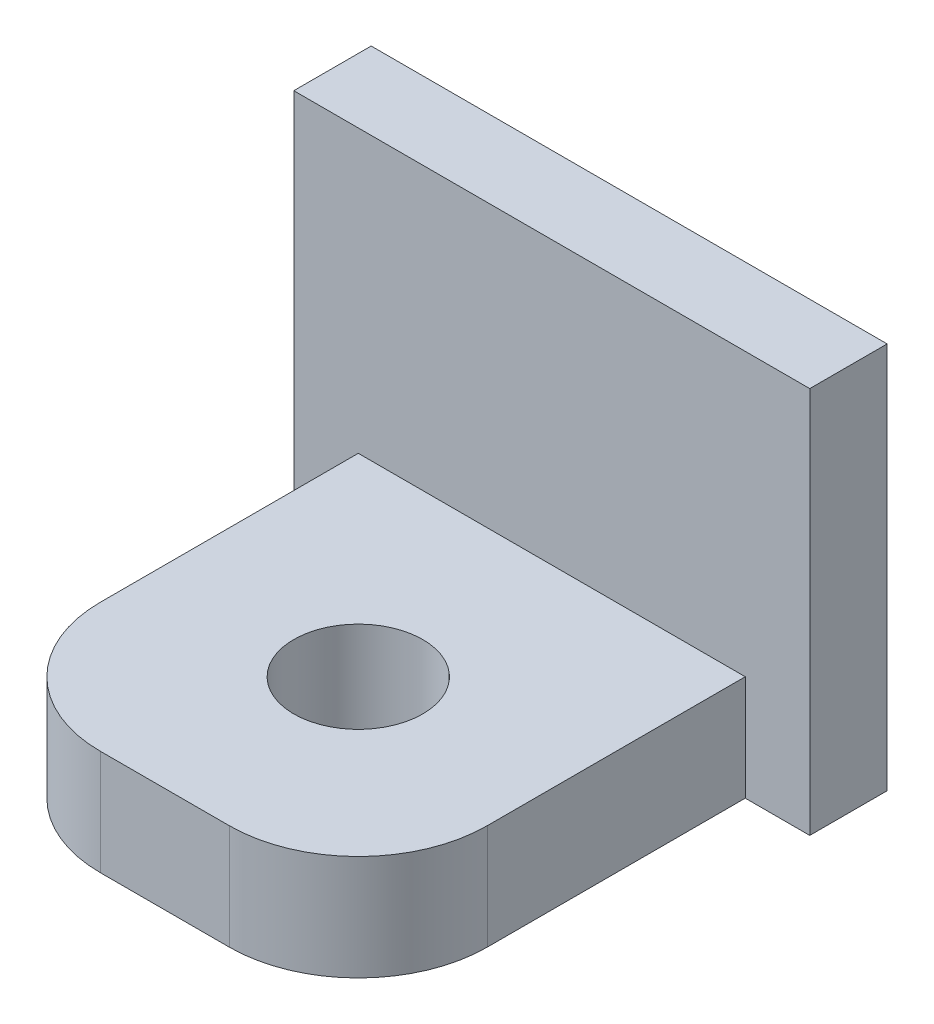
ISO-10303-21;
HEADER;
FILE_DESCRIPTION(('STEP AP214'),'2;1');
FILE_NAME('part.step','',(''),(''),'','','');
FILE_SCHEMA(('AUTOMOTIVE_DESIGN { 1 0 10303 214 1 1 1 1 }'));
ENDSEC;
DATA;
#1=APPLICATION_CONTEXT('core data for automotive mechanical design processes');
#2=APPLICATION_PROTOCOL_DEFINITION('international standard','automotive_design',2000,#1);
#3=PRODUCT_CONTEXT('',#1,'mechanical');
#4=PRODUCT('Part','Part','',(#3));
#5=PRODUCT_RELATED_PRODUCT_CATEGORY('part','',(#4));
#6=PRODUCT_DEFINITION_FORMATION('','',#4);
#7=PRODUCT_DEFINITION_CONTEXT('part definition',#1,'design');
#8=PRODUCT_DEFINITION('design','',#6,#7);
#9=PRODUCT_DEFINITION_SHAPE('','',#8);
#10=(LENGTH_UNIT() NAMED_UNIT(*) SI_UNIT(.MILLI.,.METRE.));
#11=(NAMED_UNIT(*) PLANE_ANGLE_UNIT() SI_UNIT($,.RADIAN.));
#12=(NAMED_UNIT(*) SI_UNIT($,.STERADIAN.) SOLID_ANGLE_UNIT());
#13=UNCERTAINTY_MEASURE_WITH_UNIT(LENGTH_MEASURE(1.E-05),#10,'distance_accuracy_value','');
#14=(GEOMETRIC_REPRESENTATION_CONTEXT(3) GLOBAL_UNCERTAINTY_ASSIGNED_CONTEXT((#13)) GLOBAL_UNIT_ASSIGNED_CONTEXT((#10,
#11,#12)) REPRESENTATION_CONTEXT('',''));
#15=CARTESIAN_POINT('',(0.,0.,0.));
#16=DIRECTION('',(0.,0.,1.));
#17=DIRECTION('',(1.,0.,0.));
#18=AXIS2_PLACEMENT_3D('',#15,#16,#17);
#19=CARTESIAN_POINT('',(5.,0.,26.));
#20=DIRECTION('',(0.,-1.,0.));
#21=DIRECTION('',(0.,0.,-1.));
#22=AXIS2_PLACEMENT_3D('',#19,#20,#21);
#23=CYLINDRICAL_SURFACE('',#22,10.);
#24=DIRECTION('',(0.,1.,0.));
#25=VECTOR('',#24,1.);
#26=CARTESIAN_POINT('',(5.,0.,36.));
#27=LINE('',#26,#25);
#28=CARTESIAN_POINT('',(4.99999999999999,-15.,36.));
#29=VERTEX_POINT('',#28);
#30=CARTESIAN_POINT('',(4.99999999999999,-6.84521,36.));
#31=VERTEX_POINT('',#30);
#32=EDGE_CURVE('E184',#29,#31,#27,.T.);
#33=ORIENTED_EDGE('',*,*,#32,.F.);
#34=CARTESIAN_POINT('',(5.,-15.,26.));
#35=DIRECTION('',(0.,-1.,0.));
#36=DIRECTION('',(1.,0.,0.));
#37=AXIS2_PLACEMENT_3D('',#34,#35,#36);
#38=CIRCLE('',#37,10.);
#39=CARTESIAN_POINT('',(15.,-15.,26.));
#40=VERTEX_POINT('',#39);
#41=EDGE_CURVE('E40',#40,#29,#38,.T.);
#42=ORIENTED_EDGE('',*,*,#41,.F.);
#43=DIRECTION('',(0.,1.,0.));
#44=VECTOR('',#43,1.);
#45=CARTESIAN_POINT('',(15.,0.,26.));
#46=LINE('',#45,#44);
#47=CARTESIAN_POINT('',(15.,-6.84521,26.));
#48=VERTEX_POINT('',#47);
#49=EDGE_CURVE('E187',#48,#40,#46,.F.);
#50=ORIENTED_EDGE('',*,*,#49,.F.);
#51=CARTESIAN_POINT('',(5.,-6.84521,26.));
#52=DIRECTION('',(0.,1.,0.));
#53=DIRECTION('',(0.,0.,1.));
#54=AXIS2_PLACEMENT_3D('',#51,#52,#53);
#55=CIRCLE('',#54,10.);
#56=EDGE_CURVE('E11',#31,#48,#55,.T.);
#57=ORIENTED_EDGE('',*,*,#56,.F.);
#58=EDGE_LOOP('',(#33,#42,#50,#57));
#59=FACE_BOUND('',#58,.T.);
#60=ADVANCED_FACE('F33',(#59),#23,.T.);
#61=CARTESIAN_POINT('',(-5.,-15.,26.));
#62=DIRECTION('',(0.,1.,0.));
#63=DIRECTION('',(0.,0.,1.));
#64=AXIS2_PLACEMENT_3D('',#61,#62,#63);
#65=CYLINDRICAL_SURFACE('',#64,10.);
#66=DIRECTION('',(0.,1.,0.));
#67=VECTOR('',#66,1.);
#68=CARTESIAN_POINT('',(-15.,-15.,26.));
#69=LINE('',#68,#67);
#70=CARTESIAN_POINT('',(-15.,-15.,26.));
#71=VERTEX_POINT('',#70);
#72=CARTESIAN_POINT('',(-15.,-6.84521,26.));
#73=VERTEX_POINT('',#72);
#74=EDGE_CURVE('E168',#71,#73,#69,.T.);
#75=ORIENTED_EDGE('',*,*,#74,.F.);
#76=CARTESIAN_POINT('',(-5.,-15.,26.));
#77=DIRECTION('',(0.,-1.,0.));
#78=DIRECTION('',(1.,0.,0.));
#79=AXIS2_PLACEMENT_3D('',#76,#77,#78);
#80=CIRCLE('',#79,10.);
#81=CARTESIAN_POINT('',(-5.,-15.,36.));
#82=VERTEX_POINT('',#81);
#83=EDGE_CURVE('E180',#82,#71,#80,.T.);
#84=ORIENTED_EDGE('',*,*,#83,.F.);
#85=DIRECTION('',(0.,1.,0.));
#86=VECTOR('',#85,1.);
#87=CARTESIAN_POINT('',(-5.,0.,36.));
#88=LINE('',#87,#86);
#89=CARTESIAN_POINT('',(-5.,-6.84521,36.));
#90=VERTEX_POINT('',#89);
#91=EDGE_CURVE('E177',#90,#82,#88,.F.);
#92=ORIENTED_EDGE('',*,*,#91,.F.);
#93=CARTESIAN_POINT('',(-5.,-6.84521,26.));
#94=DIRECTION('',(0.,1.,0.));
#95=DIRECTION('',(0.,0.,1.));
#96=AXIS2_PLACEMENT_3D('',#93,#94,#95);
#97=CIRCLE('',#96,10.);
#98=EDGE_CURVE('E182',#73,#90,#97,.T.);
#99=ORIENTED_EDGE('',*,*,#98,.F.);
#100=EDGE_LOOP('',(#75,#84,#92,#99));
#101=FACE_BOUND('',#100,.T.);
#102=ADVANCED_FACE('F216',(#101),#65,.T.);
#103=CARTESIAN_POINT('',(20.,15.,6.));
#104=DIRECTION('',(1.,0.,0.));
#105=DIRECTION('',(0.,1.,0.));
#106=AXIS2_PLACEMENT_3D('',#103,#104,#105);
#107=PLANE('',#106);
#108=DIRECTION('',(0.,-1.,0.));
#109=VECTOR('',#108,1.);
#110=CARTESIAN_POINT('',(20.,15.,0.));
#111=LINE('',#110,#109);
#112=CARTESIAN_POINT('',(20.,15.,0.));
#113=VERTEX_POINT('',#112);
#114=CARTESIAN_POINT('',(20.,-15.,0.));
#115=VERTEX_POINT('',#114);
#116=EDGE_CURVE('E143',#113,#115,#111,.T.);
#117=ORIENTED_EDGE('',*,*,#116,.F.);
#118=DIRECTION('',(0.,0.,-1.));
#119=VECTOR('',#118,1.);
#120=CARTESIAN_POINT('',(20.,15.,6.));
#121=LINE('',#120,#119);
#122=CARTESIAN_POINT('',(20.,15.,6.));
#123=VERTEX_POINT('',#122);
#124=EDGE_CURVE('E166',#123,#113,#121,.T.);
#125=ORIENTED_EDGE('',*,*,#124,.F.);
#126=DIRECTION('',(0.,-1.,0.));
#127=VECTOR('',#126,1.);
#128=CARTESIAN_POINT('',(20.,15.,6.));
#129=LINE('',#128,#127);
#130=CARTESIAN_POINT('',(20.,-15.,6.));
#131=VERTEX_POINT('',#130);
#132=EDGE_CURVE('E144',#123,#131,#129,.T.);
#133=ORIENTED_EDGE('',*,*,#132,.T.);
#134=DIRECTION('',(0.,0.,-1.));
#135=VECTOR('',#134,1.);
#136=CARTESIAN_POINT('',(20.,-15.,6.));
#137=LINE('',#136,#135);
#138=EDGE_CURVE('E156',#131,#115,#137,.T.);
#139=ORIENTED_EDGE('',*,*,#138,.T.);
#140=EDGE_LOOP('',(#117,#125,#133,#139));
#141=FACE_BOUND('',#140,.T.);
#142=ADVANCED_FACE('F220',(#141),#107,.T.);
#143=CARTESIAN_POINT('',(20.,15.,6.));
#144=DIRECTION('',(0.,-1.,0.));
#145=DIRECTION('',(1.,0.,0.));
#146=AXIS2_PLACEMENT_3D('',#143,#144,#145);
#147=PLANE('',#146);
#148=DIRECTION('',(-1.,0.,0.));
#149=VECTOR('',#148,1.);
#150=CARTESIAN_POINT('',(20.,15.,0.));
#151=LINE('',#150,#149);
#152=CARTESIAN_POINT('',(-20.,15.,0.));
#153=VERTEX_POINT('',#152);
#154=EDGE_CURVE('E148',#113,#153,#151,.T.);
#155=ORIENTED_EDGE('',*,*,#154,.T.);
#156=DIRECTION('',(0.,0.,-1.));
#157=VECTOR('',#156,1.);
#158=CARTESIAN_POINT('',(-20.,15.,6.));
#159=LINE('',#158,#157);
#160=CARTESIAN_POINT('',(-20.,15.,6.));
#161=VERTEX_POINT('',#160);
#162=EDGE_CURVE('E169',#161,#153,#159,.T.);
#163=ORIENTED_EDGE('',*,*,#162,.F.);
#164=DIRECTION('',(-1.,0.,0.));
#165=VECTOR('',#164,1.);
#166=CARTESIAN_POINT('',(20.,15.,6.));
#167=LINE('',#166,#165);
#168=EDGE_CURVE('E154',#123,#161,#167,.T.);
#169=ORIENTED_EDGE('',*,*,#168,.F.);
#170=ORIENTED_EDGE('',*,*,#124,.T.);
#171=EDGE_LOOP('',(#155,#163,#169,#170));
#172=FACE_BOUND('',#171,.T.);
#173=ADVANCED_FACE('F211',(#172),#147,.F.);
#174=CARTESIAN_POINT('',(-20.,15.,6.));
#175=DIRECTION('',(1.,0.,0.));
#176=DIRECTION('',(0.,1.,0.));
#177=AXIS2_PLACEMENT_3D('',#174,#175,#176);
#178=PLANE('',#177);
#179=DIRECTION('',(0.,-1.,0.));
#180=VECTOR('',#179,1.);
#181=CARTESIAN_POINT('',(-20.,15.,0.));
#182=LINE('',#181,#180);
#183=CARTESIAN_POINT('',(-20.,-15.,0.));
#184=VERTEX_POINT('',#183);
#185=EDGE_CURVE('E162',#153,#184,#182,.T.);
#186=ORIENTED_EDGE('',*,*,#185,.T.);
#187=DIRECTION('',(0.,0.,-1.));
#188=VECTOR('',#187,1.);
#189=CARTESIAN_POINT('',(-20.,-15.,6.));
#190=LINE('',#189,#188);
#191=CARTESIAN_POINT('',(-20.,-15.,6.));
#192=VERTEX_POINT('',#191);
#193=EDGE_CURVE('E172',#192,#184,#190,.T.);
#194=ORIENTED_EDGE('',*,*,#193,.F.);
#195=DIRECTION('',(0.,-1.,0.));
#196=VECTOR('',#195,1.);
#197=CARTESIAN_POINT('',(-20.,15.,6.));
#198=LINE('',#197,#196);
#199=EDGE_CURVE('E151',#161,#192,#198,.T.);
#200=ORIENTED_EDGE('',*,*,#199,.F.);
#201=ORIENTED_EDGE('',*,*,#162,.T.);
#202=EDGE_LOOP('',(#186,#194,#200,#201));
#203=FACE_BOUND('',#202,.T.);
#204=ADVANCED_FACE('F203',(#203),#178,.F.);
#205=CARTESIAN_POINT('',(20.,-15.,6.));
#206=DIRECTION('',(0.,-1.,0.));
#207=DIRECTION('',(1.,0.,0.));
#208=AXIS2_PLACEMENT_3D('',#205,#206,#207);
#209=PLANE('',#208);
#210=CARTESIAN_POINT('',(0.,-15.,21.));
#211=DIRECTION('',(0.,-1.,0.));
#212=DIRECTION('',(1.,0.,0.));
#213=AXIS2_PLACEMENT_3D('',#210,#211,#212);
#214=CIRCLE('',#213,5.);
#215=CARTESIAN_POINT('',(5.,-15.,21.));
#216=VERTEX_POINT('',#215);
#217=EDGE_CURVE('E131',#216,#216,#214,.T.);
#218=ORIENTED_EDGE('',*,*,#217,.F.);
#219=EDGE_LOOP('',(#218));
#220=FACE_BOUND('',#219,.T.);
#221=DIRECTION('',(0.,0.,-1.));
#222=VECTOR('',#221,1.);
#223=CARTESIAN_POINT('',(15.,-15.,36.));
#224=LINE('',#223,#222);
#225=CARTESIAN_POINT('',(15.,-15.,6.));
#226=VERTEX_POINT('',#225);
#227=EDGE_CURVE('E112',#40,#226,#224,.T.);
#228=ORIENTED_EDGE('',*,*,#227,.F.);
#229=ORIENTED_EDGE('',*,*,#41,.T.);
#230=DIRECTION('',(1.,0.,0.));
#231=VECTOR('',#230,1.);
#232=CARTESIAN_POINT('',(-15.,-15.,36.));
#233=LINE('',#232,#231);
#234=EDGE_CURVE('E138',#82,#29,#233,.T.);
#235=ORIENTED_EDGE('',*,*,#234,.F.);
#236=ORIENTED_EDGE('',*,*,#83,.T.);
#237=DIRECTION('',(0.,0.,-1.));
#238=VECTOR('',#237,1.);
#239=CARTESIAN_POINT('',(-15.,-15.,36.));
#240=LINE('',#239,#238);
#241=CARTESIAN_POINT('',(-15.,-15.,6.));
#242=VERTEX_POINT('',#241);
#243=EDGE_CURVE('E139',#71,#242,#240,.T.);
#244=ORIENTED_EDGE('',*,*,#243,.T.);
#245=DIRECTION('',(-1.,0.,0.));
#246=VECTOR('',#245,1.);
#247=CARTESIAN_POINT('',(20.,-15.,6.));
#248=LINE('',#247,#246);
#249=EDGE_CURVE('E147',#242,#192,#248,.T.);
#250=ORIENTED_EDGE('',*,*,#249,.T.);
#251=ORIENTED_EDGE('',*,*,#193,.T.);
#252=DIRECTION('',(-1.,0.,0.));
#253=VECTOR('',#252,1.);
#254=CARTESIAN_POINT('',(20.,-15.,0.));
#255=LINE('',#254,#253);
#256=EDGE_CURVE('E159',#115,#184,#255,.T.);
#257=ORIENTED_EDGE('',*,*,#256,.F.);
#258=ORIENTED_EDGE('',*,*,#138,.F.);
#259=EDGE_CURVE('E149',#131,#226,#248,.T.);
#260=ORIENTED_EDGE('',*,*,#259,.T.);
#261=EDGE_LOOP('',(#228,#229,#235,#236,#244,#250,#251,#257,#258,#260));
#262=FACE_BOUND('',#261,.T.);
#263=ADVANCED_FACE('F190',(#220,#262),#209,.T.);
#264=CARTESIAN_POINT('',(0.,0.,6.));
#265=DIRECTION('',(0.,0.,-1.));
#266=DIRECTION('',(-1.,0.,0.));
#267=AXIS2_PLACEMENT_3D('',#264,#265,#266);
#268=PLANE('',#267);
#269=ORIENTED_EDGE('',*,*,#249,.F.);
#270=DIRECTION('',(0.,1.,0.));
#271=VECTOR('',#270,1.);
#272=CARTESIAN_POINT('',(-15.,-15.,6.));
#273=LINE('',#272,#271);
#274=CARTESIAN_POINT('',(-15.,-6.84521,6.));
#275=VERTEX_POINT('',#274);
#276=EDGE_CURVE('E124',#242,#275,#273,.T.);
#277=ORIENTED_EDGE('',*,*,#276,.T.);
#278=DIRECTION('',(1.,0.,0.));
#279=VECTOR('',#278,1.);
#280=CARTESIAN_POINT('',(-15.,-6.84521,6.));
#281=LINE('',#280,#279);
#282=CARTESIAN_POINT('',(15.,-6.84521,6.));
#283=VERTEX_POINT('',#282);
#284=EDGE_CURVE('E109',#275,#283,#281,.T.);
#285=ORIENTED_EDGE('',*,*,#284,.T.);
#286=DIRECTION('',(0.,1.,0.));
#287=VECTOR('',#286,1.);
#288=CARTESIAN_POINT('',(15.,-15.,6.));
#289=LINE('',#288,#287);
#290=EDGE_CURVE('E121',#226,#283,#289,.T.);
#291=ORIENTED_EDGE('',*,*,#290,.F.);
#292=ORIENTED_EDGE('',*,*,#259,.F.);
#293=ORIENTED_EDGE('',*,*,#132,.F.);
#294=ORIENTED_EDGE('',*,*,#168,.T.);
#295=ORIENTED_EDGE('',*,*,#199,.T.);
#296=EDGE_LOOP('',(#269,#277,#285,#291,#292,#293,#294,#295));
#297=FACE_BOUND('',#296,.T.);
#298=ADVANCED_FACE('F119',(#297),#268,.F.);
#299=CARTESIAN_POINT('',(0.,0.,0.));
#300=DIRECTION('',(0.,0.,-1.));
#301=DIRECTION('',(-1.,0.,0.));
#302=AXIS2_PLACEMENT_3D('',#299,#300,#301);
#303=PLANE('',#302);
#304=ORIENTED_EDGE('',*,*,#116,.T.);
#305=ORIENTED_EDGE('',*,*,#256,.T.);
#306=ORIENTED_EDGE('',*,*,#185,.F.);
#307=ORIENTED_EDGE('',*,*,#154,.F.);
#308=EDGE_LOOP('',(#304,#305,#306,#307));
#309=FACE_BOUND('',#308,.T.);
#310=ADVANCED_FACE('F209',(#309),#303,.T.);
#311=CARTESIAN_POINT('',(15.,-15.,36.));
#312=DIRECTION('',(-1.,0.,0.));
#313=DIRECTION('',(0.,0.,1.));
#314=AXIS2_PLACEMENT_3D('',#311,#312,#313);
#315=PLANE('',#314);
#316=DIRECTION('',(0.,0.,-1.));
#317=VECTOR('',#316,1.);
#318=CARTESIAN_POINT('',(15.,-6.84521,36.));
#319=LINE('',#318,#317);
#320=EDGE_CURVE('E105',#48,#283,#319,.T.);
#321=ORIENTED_EDGE('',*,*,#320,.F.);
#322=ORIENTED_EDGE('',*,*,#49,.T.);
#323=ORIENTED_EDGE('',*,*,#227,.T.);
#324=ORIENTED_EDGE('',*,*,#290,.T.);
#325=EDGE_LOOP('',(#321,#322,#323,#324));
#326=FACE_BOUND('',#325,.T.);
#327=ADVANCED_FACE('F126',(#326),#315,.F.);
#328=CARTESIAN_POINT('',(-15.,-6.84521,36.));
#329=DIRECTION('',(0.,1.,0.));
#330=DIRECTION('',(0.,0.,1.));
#331=AXIS2_PLACEMENT_3D('',#328,#329,#330);
#332=PLANE('',#331);
#333=CARTESIAN_POINT('',(0.,-6.84520999999999,21.));
#334=DIRECTION('',(0.,1.,0.));
#335=DIRECTION('',(0.,0.,1.));
#336=AXIS2_PLACEMENT_3D('',#333,#334,#335);
#337=CIRCLE('',#336,5.);
#338=CARTESIAN_POINT('',(5.,-6.84520999999999,21.));
#339=VERTEX_POINT('',#338);
#340=EDGE_CURVE('E128',#339,#339,#337,.T.);
#341=ORIENTED_EDGE('',*,*,#340,.F.);
#342=EDGE_LOOP('',(#341));
#343=FACE_BOUND('',#342,.T.);
#344=DIRECTION('',(1.,0.,0.));
#345=VECTOR('',#344,1.);
#346=CARTESIAN_POINT('',(-15.,-6.84521,36.));
#347=LINE('',#346,#345);
#348=EDGE_CURVE('E134',#90,#31,#347,.T.);
#349=ORIENTED_EDGE('',*,*,#348,.T.);
#350=ORIENTED_EDGE('',*,*,#56,.T.);
#351=ORIENTED_EDGE('',*,*,#320,.T.);
#352=ORIENTED_EDGE('',*,*,#284,.F.);
#353=DIRECTION('',(0.,0.,-1.));
#354=VECTOR('',#353,1.);
#355=CARTESIAN_POINT('',(-15.,-6.84521,36.));
#356=LINE('',#355,#354);
#357=EDGE_CURVE('E113',#73,#275,#356,.T.);
#358=ORIENTED_EDGE('',*,*,#357,.F.);
#359=ORIENTED_EDGE('',*,*,#98,.T.);
#360=EDGE_LOOP('',(#349,#350,#351,#352,#358,#359));
#361=FACE_BOUND('',#360,.T.);
#362=ADVANCED_FACE('F107',(#343,#361),#332,.T.);
#363=CARTESIAN_POINT('',(-15.,-15.,36.));
#364=DIRECTION('',(-1.,0.,0.));
#365=DIRECTION('',(0.,0.,1.));
#366=AXIS2_PLACEMENT_3D('',#363,#364,#365);
#367=PLANE('',#366);
#368=ORIENTED_EDGE('',*,*,#243,.F.);
#369=ORIENTED_EDGE('',*,*,#74,.T.);
#370=ORIENTED_EDGE('',*,*,#357,.T.);
#371=ORIENTED_EDGE('',*,*,#276,.F.);
#372=EDGE_LOOP('',(#368,#369,#370,#371));
#373=FACE_BOUND('',#372,.T.);
#374=ADVANCED_FACE('F229',(#373),#367,.T.);
#375=CARTESIAN_POINT('',(0.,0.,36.));
#376=DIRECTION('',(0.,0.,1.));
#377=DIRECTION('',(1.,0.,0.));
#378=AXIS2_PLACEMENT_3D('',#375,#376,#377);
#379=PLANE('',#378);
#380=ORIENTED_EDGE('',*,*,#234,.T.);
#381=ORIENTED_EDGE('',*,*,#32,.T.);
#382=ORIENTED_EDGE('',*,*,#348,.F.);
#383=ORIENTED_EDGE('',*,*,#91,.T.);
#384=EDGE_LOOP('',(#380,#381,#382,#383));
#385=FACE_BOUND('',#384,.T.);
#386=ADVANCED_FACE('F194',(#385),#379,.T.);
#387=CARTESIAN_POINT('',(0.,15.,21.));
#388=DIRECTION('',(0.,-1.,0.));
#389=DIRECTION('',(1.,0.,0.));
#390=AXIS2_PLACEMENT_3D('',#387,#388,#389);
#391=CYLINDRICAL_SURFACE('',#390,5.);
#392=CARTESIAN_POINT('',(5.,-6.84520999999999,21.));
#393=CARTESIAN_POINT('',(5.,-6.93015572916666,21.));
#394=CARTESIAN_POINT('',(5.,-7.01510145833332,21.));
#395=CARTESIAN_POINT('',(5.,-7.18499291666665,21.));
#396=CARTESIAN_POINT('',(5.,-7.26993864583332,21.));
#397=CARTESIAN_POINT('',(5.,-7.43983010416666,21.));
#398=CARTESIAN_POINT('',(5.,-7.52477583333332,21.));
#399=CARTESIAN_POINT('',(5.,-7.69466729166666,21.));
#400=CARTESIAN_POINT('',(5.,-7.77961302083332,21.));
#401=CARTESIAN_POINT('',(5.,-7.94950447916666,21.));
#402=CARTESIAN_POINT('',(5.,-8.03445020833333,21.));
#403=CARTESIAN_POINT('',(5.,-8.20434166666666,21.));
#404=CARTESIAN_POINT('',(5.,-8.28928739583332,21.));
#405=CARTESIAN_POINT('',(5.,-8.45917885416666,21.));
#406=CARTESIAN_POINT('',(5.,-8.54412458333332,21.));
#407=CARTESIAN_POINT('',(5.,-8.71401604166666,21.));
#408=CARTESIAN_POINT('',(5.,-8.79896177083332,21.));
#409=CARTESIAN_POINT('',(5.,-8.96885322916666,21.));
#410=CARTESIAN_POINT('',(5.,-9.05379895833332,21.));
#411=CARTESIAN_POINT('',(5.,-9.22369041666666,21.));
#412=CARTESIAN_POINT('',(5.,-9.30863614583333,21.));
#413=CARTESIAN_POINT('',(5.,-9.47852760416666,21.));
#414=CARTESIAN_POINT('',(5.,-9.56347333333333,21.));
#415=CARTESIAN_POINT('',(5.,-9.73336479166666,21.));
#416=CARTESIAN_POINT('',(5.,-9.81831052083333,21.));
#417=CARTESIAN_POINT('',(5.,-9.98820197916666,21.));
#418=CARTESIAN_POINT('',(5.,-10.0731477083333,21.));
#419=CARTESIAN_POINT('',(5.,-10.2430391666667,21.));
#420=CARTESIAN_POINT('',(5.,-10.3279848958333,21.));
#421=CARTESIAN_POINT('',(5.,-10.4978763541667,21.));
#422=CARTESIAN_POINT('',(5.,-10.5828220833333,21.));
#423=CARTESIAN_POINT('',(5.,-10.7527135416667,21.));
#424=CARTESIAN_POINT('',(5.,-10.8376592708333,21.));
#425=CARTESIAN_POINT('',(5.,-11.0075507291667,21.));
#426=CARTESIAN_POINT('',(5.,-11.0924964583333,21.));
#427=CARTESIAN_POINT('',(5.,-11.2623879166667,21.));
#428=CARTESIAN_POINT('',(5.,-11.3473336458333,21.));
#429=CARTESIAN_POINT('',(5.,-11.5172251041667,21.));
#430=CARTESIAN_POINT('',(5.,-11.6021708333333,21.));
#431=CARTESIAN_POINT('',(5.,-11.7720622916667,21.));
#432=CARTESIAN_POINT('',(5.,-11.8570080208333,21.));
#433=CARTESIAN_POINT('',(5.,-12.0268994791667,21.));
#434=CARTESIAN_POINT('',(5.,-12.1118452083333,21.));
#435=CARTESIAN_POINT('',(5.,-12.2817366666667,21.));
#436=CARTESIAN_POINT('',(5.,-12.3666823958333,21.));
#437=CARTESIAN_POINT('',(5.,-12.5365738541667,21.));
#438=CARTESIAN_POINT('',(5.,-12.6215195833333,21.));
#439=CARTESIAN_POINT('',(5.,-12.7914110416667,21.));
#440=CARTESIAN_POINT('',(5.,-12.8763567708333,21.));
#441=CARTESIAN_POINT('',(5.,-13.0462482291667,21.));
#442=CARTESIAN_POINT('',(5.,-13.1311939583333,21.));
#443=CARTESIAN_POINT('',(5.,-13.3010854166667,21.));
#444=CARTESIAN_POINT('',(5.,-13.3860311458333,21.));
#445=CARTESIAN_POINT('',(5.,-13.5559226041667,21.));
#446=CARTESIAN_POINT('',(5.,-13.6408683333333,21.));
#447=CARTESIAN_POINT('',(5.,-13.8107597916667,21.));
#448=CARTESIAN_POINT('',(5.,-13.8957055208333,21.));
#449=CARTESIAN_POINT('',(5.,-14.0655969791667,21.));
#450=CARTESIAN_POINT('',(5.,-14.1505427083333,21.));
#451=CARTESIAN_POINT('',(5.,-14.3204341666667,21.));
#452=CARTESIAN_POINT('',(5.,-14.4053798958333,21.));
#453=CARTESIAN_POINT('',(5.,-14.5752713541667,21.));
#454=CARTESIAN_POINT('',(5.,-14.6602170833333,21.));
#455=CARTESIAN_POINT('',(5.,-14.8301085416667,21.));
#456=CARTESIAN_POINT('',(5.,-14.9150542708333,21.));
#457=CARTESIAN_POINT('',(5.,-15.,21.));
#458=B_SPLINE_CURVE_WITH_KNOTS('',3,(#392,#393,#394,#395,#396,#397,#398,#399,#400,#401,#402,
#403,#404,#405,#406,#407,#408,#409,#410,#411,#412,#413,#414,#415,#416,#417,#418,#419,#420,#421,
#422,#423,#424,#425,#426,#427,#428,#429,#430,#431,#432,#433,#434,#435,#436,#437,#438,#439,#440,
#441,#442,#443,#444,#445,#446,#447,#448,#449,#450,#451,#452,#453,#454,#455,#456,#457),
.UNSPECIFIED.,.F.,.F.,(4,2,2,2,2,2,2,2,2,2,2,2,2,2,2,2,2,2,2,2,2,2,2,2,2,2,2,2,2,2,2,2,4),(0.,
0.254837187499999,0.509674375000001,0.7645115625,1.01934875,1.2741859375,1.529023125,
1.7838603125,2.0386975,2.2935346875,2.548371875,2.8032090625,3.05804625,3.3128834375,
3.567720625,3.82255781250001,4.077395,4.33223218750001,4.58706937500001,4.8419065625,
5.09674375000001,5.35158093750001,5.60641812500001,5.86125531250001,6.11609250000001,
6.37092968750001,6.62576687500001,6.88060406250001,7.13544125000001,7.39027843750001,
7.64511562500001,7.89995281250001,8.15479000000001),.UNSPECIFIED.);
#459=EDGE_CURVE('BSEAM200',#339,#216,#458,.T.);
#460=ORIENTED_EDGE('',*,*,#340,.T.);
#461=ORIENTED_EDGE('',*,*,#217,.T.);
#462=ORIENTED_EDGE('',*,*,#459,.T.);
#463=ORIENTED_EDGE('',*,*,#459,.F.);
#464=EDGE_LOOP('',(#460,#462,#461,#463));
#465=FACE_BOUND('',#464,.T.);
#466=ADVANCED_FACE('F200',(#465),#391,.F.);
#467=CLOSED_SHELL('',(#60,#102,#142,#173,#204,#263,#298,#310,#327,#362,#374,#386,#466));
#468=MANIFOLD_SOLID_BREP('B2',#467);
#469=ADVANCED_BREP_SHAPE_REPRESENTATION('',(#18,#468),#14);
#470=SHAPE_DEFINITION_REPRESENTATION(#9,#469);
ENDSEC;
END-ISO-10303-21;
